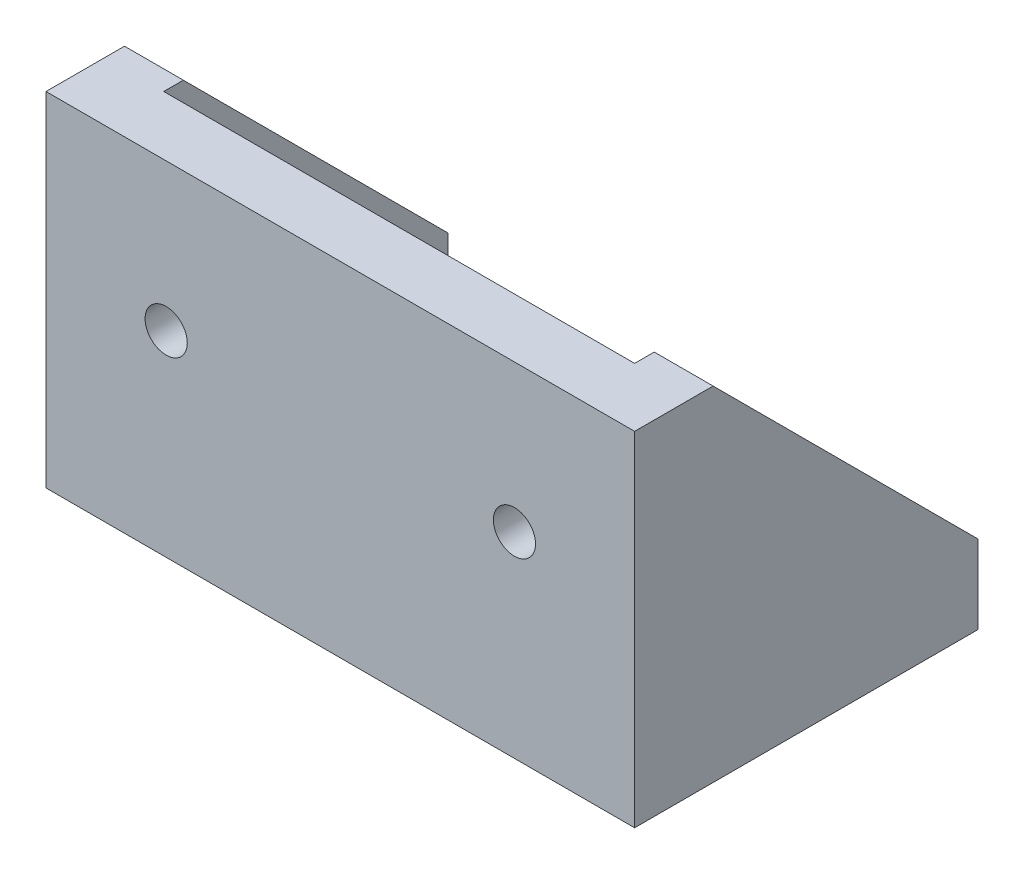
ISO-10303-21;
HEADER;
FILE_DESCRIPTION(('STEP AP214'),'2;1');
FILE_NAME('part.step','',(''),(''),'','','');
FILE_SCHEMA(('AUTOMOTIVE_DESIGN { 1 0 10303 214 1 1 1 1 }'));
ENDSEC;
DATA;
#1=APPLICATION_CONTEXT('core data for automotive mechanical design processes');
#2=APPLICATION_PROTOCOL_DEFINITION('international standard','automotive_design',2000,#1);
#3=PRODUCT_CONTEXT('',#1,'mechanical');
#4=PRODUCT('Part','Part','',(#3));
#5=PRODUCT_RELATED_PRODUCT_CATEGORY('part','',(#4));
#6=PRODUCT_DEFINITION_FORMATION('','',#4);
#7=PRODUCT_DEFINITION_CONTEXT('part definition',#1,'design');
#8=PRODUCT_DEFINITION('design','',#6,#7);
#9=PRODUCT_DEFINITION_SHAPE('','',#8);
#10=(LENGTH_UNIT() NAMED_UNIT(*) SI_UNIT(.MILLI.,.METRE.));
#11=(NAMED_UNIT(*) PLANE_ANGLE_UNIT() SI_UNIT($,.RADIAN.));
#12=(NAMED_UNIT(*) SI_UNIT($,.STERADIAN.) SOLID_ANGLE_UNIT());
#13=UNCERTAINTY_MEASURE_WITH_UNIT(LENGTH_MEASURE(1.E-05),#10,'distance_accuracy_value','');
#14=(GEOMETRIC_REPRESENTATION_CONTEXT(3) GLOBAL_UNCERTAINTY_ASSIGNED_CONTEXT((#13)) GLOBAL_UNIT_ASSIGNED_CONTEXT((#10,
#11,#12)) REPRESENTATION_CONTEXT('',''));
#15=CARTESIAN_POINT('',(0.,0.,0.));
#16=DIRECTION('',(0.,0.,1.));
#17=DIRECTION('',(1.,0.,0.));
#18=AXIS2_PLACEMENT_3D('',#15,#16,#17);
#19=CARTESIAN_POINT('',(30.,8.,-35.));
#20=DIRECTION('',(0.,-0.707106781186547,0.707106781186547));
#21=DIRECTION('',(0.,-0.707106781186548,-0.707106781186548));
#22=AXIS2_PLACEMENT_3D('',#19,#20,#21);
#23=PLANE('',#22);
#24=DIRECTION('',(-1.,0.,0.));
#25=VECTOR('',#24,1.);
#26=CARTESIAN_POINT('',(30.,8.,-35.));
#27=LINE('',#26,#25);
#28=CARTESIAN_POINT('',(30.,8.,-35.));
#29=VERTEX_POINT('',#28);
#30=CARTESIAN_POINT('',(24.,8.,-35.));
#31=VERTEX_POINT('',#30);
#32=EDGE_CURVE('E121',#29,#31,#27,.T.);
#33=ORIENTED_EDGE('',*,*,#32,.T.);
#34=DIRECTION('',(0.,0.707106781186547,0.707106781186547));
#35=VECTOR('',#34,1.);
#36=CARTESIAN_POINT('',(24.,8.,-35.));
#37=LINE('',#36,#35);
#38=CARTESIAN_POINT('',(24.,35.,-8.));
#39=VERTEX_POINT('',#38);
#40=EDGE_CURVE('E11',#31,#39,#37,.T.);
#41=ORIENTED_EDGE('',*,*,#40,.T.);
#42=DIRECTION('',(-1.,0.,0.));
#43=VECTOR('',#42,1.);
#44=CARTESIAN_POINT('',(30.,35.,-8.));
#45=LINE('',#44,#43);
#46=CARTESIAN_POINT('',(30.,35.,-8.));
#47=VERTEX_POINT('',#46);
#48=EDGE_CURVE('E142',#47,#39,#45,.T.);
#49=ORIENTED_EDGE('',*,*,#48,.F.);
#50=DIRECTION('',(0.,0.707106781186548,0.707106781186548));
#51=VECTOR('',#50,1.);
#52=CARTESIAN_POINT('',(30.,8.,-35.));
#53=LINE('',#52,#51);
#54=EDGE_CURVE('E63',#29,#47,#53,.T.);
#55=ORIENTED_EDGE('',*,*,#54,.F.);
#56=EDGE_LOOP('',(#33,#41,#49,#55));
#57=FACE_BOUND('',#56,.T.);
#58=ADVANCED_FACE('F37',(#57),#23,.F.);
#59=CARTESIAN_POINT('',(30.,35.,-8.));
#60=DIRECTION('',(0.,-1.,0.));
#61=DIRECTION('',(0.,0.,-1.));
#62=AXIS2_PLACEMENT_3D('',#59,#60,#61);
#63=PLANE('',#62);
#64=ORIENTED_EDGE('',*,*,#48,.T.);
#65=DIRECTION('',(0.,0.,-1.));
#66=VECTOR('',#65,1.);
#67=CARTESIAN_POINT('',(24.,35.,-6.));
#68=LINE('',#67,#66);
#69=CARTESIAN_POINT('',(24.,35.,-6.));
#70=VERTEX_POINT('',#69);
#71=EDGE_CURVE('E134',#70,#39,#68,.T.);
#72=ORIENTED_EDGE('',*,*,#71,.F.);
#73=DIRECTION('',(1.,0.,0.));
#74=VECTOR('',#73,1.);
#75=CARTESIAN_POINT('',(24.,35.,-6.));
#76=LINE('',#75,#74);
#77=CARTESIAN_POINT('',(-24.,35.,-6.));
#78=VERTEX_POINT('',#77);
#79=EDGE_CURVE('E178',#78,#70,#76,.T.);
#80=ORIENTED_EDGE('',*,*,#79,.F.);
#81=DIRECTION('',(0.,0.,-1.));
#82=VECTOR('',#81,1.);
#83=CARTESIAN_POINT('',(-24.,35.,-6.));
#84=LINE('',#83,#82);
#85=CARTESIAN_POINT('',(-24.,35.,-8.00000000000001));
#86=VERTEX_POINT('',#85);
#87=EDGE_CURVE('E190',#78,#86,#84,.T.);
#88=ORIENTED_EDGE('',*,*,#87,.T.);
#89=CARTESIAN_POINT('',(-30.,35.,-8.));
#90=VERTEX_POINT('',#89);
#91=EDGE_CURVE('E88',#86,#90,#45,.T.);
#92=ORIENTED_EDGE('',*,*,#91,.T.);
#93=DIRECTION('',(0.,0.,1.));
#94=VECTOR('',#93,1.);
#95=CARTESIAN_POINT('',(-30.,35.,-8.));
#96=LINE('',#95,#94);
#97=CARTESIAN_POINT('',(-30.,35.,0.));
#98=VERTEX_POINT('',#97);
#99=EDGE_CURVE('E131',#90,#98,#96,.T.);
#100=ORIENTED_EDGE('',*,*,#99,.T.);
#101=DIRECTION('',(-1.,0.,0.));
#102=VECTOR('',#101,1.);
#103=CARTESIAN_POINT('',(30.,35.,0.));
#104=LINE('',#103,#102);
#105=CARTESIAN_POINT('',(30.,35.,0.));
#106=VERTEX_POINT('',#105);
#107=EDGE_CURVE('E148',#106,#98,#104,.T.);
#108=ORIENTED_EDGE('',*,*,#107,.F.);
#109=DIRECTION('',(0.,0.,1.));
#110=VECTOR('',#109,1.);
#111=CARTESIAN_POINT('',(30.,35.,-8.));
#112=LINE('',#111,#110);
#113=EDGE_CURVE('E141',#47,#106,#112,.T.);
#114=ORIENTED_EDGE('',*,*,#113,.F.);
#115=EDGE_LOOP('',(#64,#72,#80,#88,#92,#100,#108,#114));
#116=FACE_BOUND('',#115,.T.);
#117=ADVANCED_FACE('F39',(#116),#63,.F.);
#118=CARTESIAN_POINT('',(30.,35.,0.));
#119=DIRECTION('',(0.,0.,-1.));
#120=DIRECTION('',(0.,1.,0.));
#121=AXIS2_PLACEMENT_3D('',#118,#119,#120);
#122=PLANE('',#121);
#123=CARTESIAN_POINT('',(-17.75,20.,0.));
#124=DIRECTION('',(0.,0.,1.));
#125=DIRECTION('',(1.,0.,0.));
#126=AXIS2_PLACEMENT_3D('',#123,#124,#125);
#127=CIRCLE('',#126,2.15);
#128=CARTESIAN_POINT('',(-15.6,20.,0.));
#129=VERTEX_POINT('',#128);
#130=EDGE_CURVE('E152',#129,#129,#127,.T.);
#131=ORIENTED_EDGE('',*,*,#130,.F.);
#132=EDGE_LOOP('',(#131));
#133=FACE_BOUND('',#132,.T.);
#134=CARTESIAN_POINT('',(17.75,20.,0.));
#135=DIRECTION('',(0.,0.,1.));
#136=DIRECTION('',(-1.,0.,0.));
#137=AXIS2_PLACEMENT_3D('',#134,#135,#136);
#138=CIRCLE('',#137,2.15);
#139=CARTESIAN_POINT('',(15.6,20.,0.));
#140=VERTEX_POINT('',#139);
#141=EDGE_CURVE('E158',#140,#140,#138,.T.);
#142=ORIENTED_EDGE('',*,*,#141,.F.);
#143=EDGE_LOOP('',(#142));
#144=FACE_BOUND('',#143,.T.);
#145=DIRECTION('',(0.,-1.,0.));
#146=VECTOR('',#145,1.);
#147=CARTESIAN_POINT('',(-30.,35.,0.));
#148=LINE('',#147,#146);
#149=CARTESIAN_POINT('',(-30.,0.,0.));
#150=VERTEX_POINT('',#149);
#151=EDGE_CURVE('E133',#98,#150,#148,.T.);
#152=ORIENTED_EDGE('',*,*,#151,.T.);
#153=DIRECTION('',(-1.,0.,0.));
#154=VECTOR('',#153,1.);
#155=CARTESIAN_POINT('',(30.,0.,0.));
#156=LINE('',#155,#154);
#157=CARTESIAN_POINT('',(30.,0.,0.));
#158=VERTEX_POINT('',#157);
#159=EDGE_CURVE('E120',#158,#150,#156,.T.);
#160=ORIENTED_EDGE('',*,*,#159,.F.);
#161=DIRECTION('',(0.,-1.,0.));
#162=VECTOR('',#161,1.);
#163=CARTESIAN_POINT('',(30.,35.,0.));
#164=LINE('',#163,#162);
#165=EDGE_CURVE('E97',#106,#158,#164,.T.);
#166=ORIENTED_EDGE('',*,*,#165,.F.);
#167=ORIENTED_EDGE('',*,*,#107,.T.);
#168=EDGE_LOOP('',(#152,#160,#166,#167));
#169=FACE_BOUND('',#168,.T.);
#170=ADVANCED_FACE('F199',(#133,#144,#169),#122,.F.);
#171=CARTESIAN_POINT('',(30.,0.,0.));
#172=DIRECTION('',(0.,1.,0.));
#173=DIRECTION('',(0.,0.,1.));
#174=AXIS2_PLACEMENT_3D('',#171,#172,#173);
#175=PLANE('',#174);
#176=CARTESIAN_POINT('',(0.,0.,-11.));
#177=DIRECTION('',(0.,1.,0.));
#178=DIRECTION('',(0.,0.,1.));
#179=AXIS2_PLACEMENT_3D('',#176,#177,#178);
#180=CIRCLE('',#179,3.5);
#181=CARTESIAN_POINT('',(0.,0.,-7.5));
#182=VERTEX_POINT('',#181);
#183=EDGE_CURVE('E163',#182,#182,#180,.T.);
#184=ORIENTED_EDGE('',*,*,#183,.T.);
#185=EDGE_LOOP('',(#184));
#186=FACE_BOUND('',#185,.T.);
#187=CARTESIAN_POINT('',(0.,0.,-29.));
#188=DIRECTION('',(0.,1.,0.));
#189=DIRECTION('',(0.,0.,-1.));
#190=AXIS2_PLACEMENT_3D('',#187,#188,#189);
#191=CIRCLE('',#190,3.5);
#192=CARTESIAN_POINT('',(0.,0.,-32.5));
#193=VERTEX_POINT('',#192);
#194=EDGE_CURVE('E166',#193,#193,#191,.T.);
#195=ORIENTED_EDGE('',*,*,#194,.T.);
#196=EDGE_LOOP('',(#195));
#197=FACE_BOUND('',#196,.T.);
#198=DIRECTION('',(0.,0.,-1.));
#199=VECTOR('',#198,1.);
#200=CARTESIAN_POINT('',(-30.,0.,0.));
#201=LINE('',#200,#199);
#202=CARTESIAN_POINT('',(-30.,0.,-35.));
#203=VERTEX_POINT('',#202);
#204=EDGE_CURVE('E116',#150,#203,#201,.T.);
#205=ORIENTED_EDGE('',*,*,#204,.T.);
#206=DIRECTION('',(-1.,0.,0.));
#207=VECTOR('',#206,1.);
#208=CARTESIAN_POINT('',(30.,0.,-35.));
#209=LINE('',#208,#207);
#210=CARTESIAN_POINT('',(30.,0.,-35.));
#211=VERTEX_POINT('',#210);
#212=EDGE_CURVE('E113',#211,#203,#209,.T.);
#213=ORIENTED_EDGE('',*,*,#212,.F.);
#214=DIRECTION('',(0.,0.,-1.));
#215=VECTOR('',#214,1.);
#216=CARTESIAN_POINT('',(30.,0.,0.));
#217=LINE('',#216,#215);
#218=EDGE_CURVE('E103',#158,#211,#217,.T.);
#219=ORIENTED_EDGE('',*,*,#218,.F.);
#220=ORIENTED_EDGE('',*,*,#159,.T.);
#221=EDGE_LOOP('',(#205,#213,#219,#220));
#222=FACE_BOUND('',#221,.T.);
#223=ADVANCED_FACE('F114',(#186,#197,#222),#175,.F.);
#224=CARTESIAN_POINT('',(30.,0.,-35.));
#225=DIRECTION('',(0.,0.,1.));
#226=DIRECTION('',(1.,0.,0.));
#227=AXIS2_PLACEMENT_3D('',#224,#225,#226);
#228=PLANE('',#227);
#229=DIRECTION('',(-1.,0.,0.));
#230=VECTOR('',#229,1.);
#231=CARTESIAN_POINT('',(24.,6.,-35.));
#232=LINE('',#231,#230);
#233=CARTESIAN_POINT('',(24.,6.,-35.));
#234=VERTEX_POINT('',#233);
#235=CARTESIAN_POINT('',(-24.,6.,-35.));
#236=VERTEX_POINT('',#235);
#237=EDGE_CURVE('E184',#234,#236,#232,.T.);
#238=ORIENTED_EDGE('',*,*,#237,.F.);
#239=DIRECTION('',(0.,-1.,0.));
#240=VECTOR('',#239,1.);
#241=CARTESIAN_POINT('',(24.,6.,-35.));
#242=LINE('',#241,#240);
#243=EDGE_CURVE('E156',#31,#234,#242,.T.);
#244=ORIENTED_EDGE('',*,*,#243,.F.);
#245=ORIENTED_EDGE('',*,*,#32,.F.);
#246=DIRECTION('',(0.,1.,0.));
#247=VECTOR('',#246,1.);
#248=CARTESIAN_POINT('',(30.,0.,-35.));
#249=LINE('',#248,#247);
#250=EDGE_CURVE('E107',#211,#29,#249,.T.);
#251=ORIENTED_EDGE('',*,*,#250,.F.);
#252=ORIENTED_EDGE('',*,*,#212,.T.);
#253=DIRECTION('',(0.,1.,0.));
#254=VECTOR('',#253,1.);
#255=CARTESIAN_POINT('',(-30.,0.,-35.));
#256=LINE('',#255,#254);
#257=CARTESIAN_POINT('',(-30.,8.,-35.));
#258=VERTEX_POINT('',#257);
#259=EDGE_CURVE('E137',#203,#258,#256,.T.);
#260=ORIENTED_EDGE('',*,*,#259,.T.);
#261=CARTESIAN_POINT('',(-24.,8.,-35.));
#262=VERTEX_POINT('',#261);
#263=EDGE_CURVE('E145',#262,#258,#27,.T.);
#264=ORIENTED_EDGE('',*,*,#263,.F.);
#265=DIRECTION('',(0.,1.,0.));
#266=VECTOR('',#265,1.);
#267=CARTESIAN_POINT('',(-24.,6.,-35.));
#268=LINE('',#267,#266);
#269=EDGE_CURVE('E54',#236,#262,#268,.T.);
#270=ORIENTED_EDGE('',*,*,#269,.F.);
#271=EDGE_LOOP('',(#238,#244,#245,#251,#252,#260,#264,#270));
#272=FACE_BOUND('',#271,.T.);
#273=ADVANCED_FACE('F124',(#272),#228,.F.);
#274=ORIENTED_EDGE('',*,*,#91,.F.);
#275=DIRECTION('',(0.,-0.707106781186547,-0.707106781186547));
#276=VECTOR('',#275,1.);
#277=CARTESIAN_POINT('',(-24.,8.,-35.));
#278=LINE('',#277,#276);
#279=EDGE_CURVE('E46',#86,#262,#278,.T.);
#280=ORIENTED_EDGE('',*,*,#279,.T.);
#281=ORIENTED_EDGE('',*,*,#263,.T.);
#282=DIRECTION('',(0.,0.707106781186548,0.707106781186548));
#283=VECTOR('',#282,1.);
#284=CARTESIAN_POINT('',(-30.,8.,-35.));
#285=LINE('',#284,#283);
#286=EDGE_CURVE('E139',#258,#90,#285,.T.);
#287=ORIENTED_EDGE('',*,*,#286,.T.);
#288=EDGE_LOOP('',(#274,#280,#281,#287));
#289=FACE_BOUND('',#288,.T.);
#290=ADVANCED_FACE('F206',(#289),#23,.F.);
#291=CARTESIAN_POINT('',(30.,0.,0.));
#292=DIRECTION('',(1.,0.,0.));
#293=DIRECTION('',(0.,0.,-1.));
#294=AXIS2_PLACEMENT_3D('',#291,#292,#293);
#295=PLANE('',#294);
#296=ORIENTED_EDGE('',*,*,#113,.T.);
#297=ORIENTED_EDGE('',*,*,#165,.T.);
#298=ORIENTED_EDGE('',*,*,#218,.T.);
#299=ORIENTED_EDGE('',*,*,#250,.T.);
#300=ORIENTED_EDGE('',*,*,#54,.T.);
#301=EDGE_LOOP('',(#296,#297,#298,#299,#300));
#302=FACE_BOUND('',#301,.T.);
#303=ADVANCED_FACE('F105',(#302),#295,.T.);
#304=CARTESIAN_POINT('',(-30.,0.,0.));
#305=DIRECTION('',(1.,0.,0.));
#306=DIRECTION('',(0.,0.,-1.));
#307=AXIS2_PLACEMENT_3D('',#304,#305,#306);
#308=PLANE('',#307);
#309=ORIENTED_EDGE('',*,*,#99,.F.);
#310=ORIENTED_EDGE('',*,*,#286,.F.);
#311=ORIENTED_EDGE('',*,*,#259,.F.);
#312=ORIENTED_EDGE('',*,*,#204,.F.);
#313=ORIENTED_EDGE('',*,*,#151,.F.);
#314=EDGE_LOOP('',(#309,#310,#311,#312,#313));
#315=FACE_BOUND('',#314,.T.);
#316=ADVANCED_FACE('F201',(#315),#308,.F.);
#317=CARTESIAN_POINT('',(24.,6.,-6.));
#318=DIRECTION('',(1.,0.,0.));
#319=DIRECTION('',(0.,0.,-1.));
#320=AXIS2_PLACEMENT_3D('',#317,#318,#319);
#321=PLANE('',#320);
#322=ORIENTED_EDGE('',*,*,#243,.T.);
#323=DIRECTION('',(0.,0.,-1.));
#324=VECTOR('',#323,1.);
#325=CARTESIAN_POINT('',(24.,6.,-6.));
#326=LINE('',#325,#324);
#327=CARTESIAN_POINT('',(24.,6.,-6.));
#328=VERTEX_POINT('',#327);
#329=EDGE_CURVE('E181',#328,#234,#326,.T.);
#330=ORIENTED_EDGE('',*,*,#329,.F.);
#331=DIRECTION('',(0.,-1.,0.));
#332=VECTOR('',#331,1.);
#333=CARTESIAN_POINT('',(24.,6.,-6.));
#334=LINE('',#333,#332);
#335=EDGE_CURVE('E169',#70,#328,#334,.T.);
#336=ORIENTED_EDGE('',*,*,#335,.F.);
#337=ORIENTED_EDGE('',*,*,#71,.T.);
#338=ORIENTED_EDGE('',*,*,#40,.F.);
#339=EDGE_LOOP('',(#322,#330,#336,#337,#338));
#340=FACE_BOUND('',#339,.T.);
#341=ADVANCED_FACE('F237',(#340),#321,.F.);
#342=CARTESIAN_POINT('',(-24.,6.,-6.));
#343=DIRECTION('',(-1.,0.,0.));
#344=DIRECTION('',(0.,0.,1.));
#345=AXIS2_PLACEMENT_3D('',#342,#343,#344);
#346=PLANE('',#345);
#347=ORIENTED_EDGE('',*,*,#87,.F.);
#348=DIRECTION('',(0.,1.,0.));
#349=VECTOR('',#348,1.);
#350=CARTESIAN_POINT('',(-24.,6.,-6.));
#351=LINE('',#350,#349);
#352=CARTESIAN_POINT('',(-24.,6.,-6.));
#353=VERTEX_POINT('',#352);
#354=EDGE_CURVE('E175',#353,#78,#351,.T.);
#355=ORIENTED_EDGE('',*,*,#354,.F.);
#356=DIRECTION('',(0.,0.,-1.));
#357=VECTOR('',#356,1.);
#358=CARTESIAN_POINT('',(-24.,6.,-6.));
#359=LINE('',#358,#357);
#360=EDGE_CURVE('E192',#353,#236,#359,.T.);
#361=ORIENTED_EDGE('',*,*,#360,.T.);
#362=ORIENTED_EDGE('',*,*,#269,.T.);
#363=ORIENTED_EDGE('',*,*,#279,.F.);
#364=EDGE_LOOP('',(#347,#355,#361,#362,#363));
#365=FACE_BOUND('',#364,.T.);
#366=ADVANCED_FACE('F209',(#365),#346,.F.);
#367=CARTESIAN_POINT('',(24.,6.,-6.));
#368=DIRECTION('',(0.,-1.,0.));
#369=DIRECTION('',(0.,0.,-1.));
#370=AXIS2_PLACEMENT_3D('',#367,#368,#369);
#371=PLANE('',#370);
#372=CARTESIAN_POINT('',(0.,6.,-11.));
#373=DIRECTION('',(0.,1.,0.));
#374=DIRECTION('',(0.,0.,1.));
#375=AXIS2_PLACEMENT_3D('',#372,#373,#374);
#376=CIRCLE('',#375,3.5);
#377=CARTESIAN_POINT('',(0.,6.,-7.5));
#378=VERTEX_POINT('',#377);
#379=EDGE_CURVE('E292',#378,#378,#376,.T.);
#380=ORIENTED_EDGE('',*,*,#379,.F.);
#381=EDGE_LOOP('',(#380));
#382=FACE_BOUND('',#381,.T.);
#383=CARTESIAN_POINT('',(0.,6.,-29.));
#384=DIRECTION('',(0.,1.,0.));
#385=DIRECTION('',(0.,0.,-1.));
#386=AXIS2_PLACEMENT_3D('',#383,#384,#385);
#387=CIRCLE('',#386,3.5);
#388=CARTESIAN_POINT('',(0.,6.,-32.5));
#389=VERTEX_POINT('',#388);
#390=EDGE_CURVE('E295',#389,#389,#387,.T.);
#391=ORIENTED_EDGE('',*,*,#390,.F.);
#392=EDGE_LOOP('',(#391));
#393=FACE_BOUND('',#392,.T.);
#394=ORIENTED_EDGE('',*,*,#237,.T.);
#395=ORIENTED_EDGE('',*,*,#360,.F.);
#396=DIRECTION('',(-1.,0.,0.));
#397=VECTOR('',#396,1.);
#398=CARTESIAN_POINT('',(24.,6.,-6.));
#399=LINE('',#398,#397);
#400=EDGE_CURVE('E172',#328,#353,#399,.T.);
#401=ORIENTED_EDGE('',*,*,#400,.F.);
#402=ORIENTED_EDGE('',*,*,#329,.T.);
#403=EDGE_LOOP('',(#394,#395,#401,#402));
#404=FACE_BOUND('',#403,.T.);
#405=ADVANCED_FACE('F235',(#382,#393,#404),#371,.F.);
#406=CARTESIAN_POINT('',(0.,0.,-6.));
#407=DIRECTION('',(0.,0.,1.));
#408=DIRECTION('',(1.,0.,0.));
#409=AXIS2_PLACEMENT_3D('',#406,#407,#408);
#410=PLANE('',#409);
#411=CARTESIAN_POINT('',(-17.75,20.,-6.));
#412=DIRECTION('',(0.,0.,1.));
#413=DIRECTION('',(1.,0.,0.));
#414=AXIS2_PLACEMENT_3D('',#411,#412,#413);
#415=CIRCLE('',#414,2.15);
#416=CARTESIAN_POINT('',(-15.6,20.,-6.));
#417=VERTEX_POINT('',#416);
#418=EDGE_CURVE('E41',#417,#417,#415,.T.);
#419=ORIENTED_EDGE('',*,*,#418,.T.);
#420=EDGE_LOOP('',(#419));
#421=FACE_BOUND('',#420,.T.);
#422=CARTESIAN_POINT('',(17.75,20.,-6.));
#423=DIRECTION('',(0.,0.,1.));
#424=DIRECTION('',(1.,0.,0.));
#425=AXIS2_PLACEMENT_3D('',#422,#423,#424);
#426=CIRCLE('',#425,2.15);
#427=CARTESIAN_POINT('',(19.9,20.,-6.));
#428=VERTEX_POINT('',#427);
#429=EDGE_CURVE('E150',#428,#428,#426,.T.);
#430=ORIENTED_EDGE('',*,*,#429,.T.);
#431=EDGE_LOOP('',(#430));
#432=FACE_BOUND('',#431,.T.);
#433=ORIENTED_EDGE('',*,*,#335,.T.);
#434=ORIENTED_EDGE('',*,*,#400,.T.);
#435=ORIENTED_EDGE('',*,*,#354,.T.);
#436=ORIENTED_EDGE('',*,*,#79,.T.);
#437=EDGE_LOOP('',(#433,#434,#435,#436));
#438=FACE_BOUND('',#437,.T.);
#439=ADVANCED_FACE('F219',(#421,#432,#438),#410,.F.);
#440=CARTESIAN_POINT('',(17.75,20.,-35.));
#441=DIRECTION('',(0.,0.,1.));
#442=DIRECTION('',(1.,0.,0.));
#443=AXIS2_PLACEMENT_3D('',#440,#441,#442);
#444=CYLINDRICAL_SURFACE('',#443,2.15);
#445=ORIENTED_EDGE('',*,*,#141,.T.);
#446=EDGE_LOOP('',(#445));
#447=FACE_BOUND('',#446,.T.);
#448=ORIENTED_EDGE('',*,*,#429,.F.);
#449=EDGE_LOOP('',(#448));
#450=FACE_BOUND('',#449,.T.);
#451=ADVANCED_FACE('F271',(#447,#450),#444,.F.);
#452=CARTESIAN_POINT('',(-17.75,20.,-35.));
#453=DIRECTION('',(0.,0.,1.));
#454=DIRECTION('',(1.,0.,0.));
#455=AXIS2_PLACEMENT_3D('',#452,#453,#454);
#456=CYLINDRICAL_SURFACE('',#455,2.15);
#457=ORIENTED_EDGE('',*,*,#130,.T.);
#458=EDGE_LOOP('',(#457));
#459=FACE_BOUND('',#458,.T.);
#460=ORIENTED_EDGE('',*,*,#418,.F.);
#461=EDGE_LOOP('',(#460));
#462=FACE_BOUND('',#461,.T.);
#463=ADVANCED_FACE('F274',(#459,#462),#456,.F.);
#464=CARTESIAN_POINT('',(0.,0.,-29.));
#465=DIRECTION('',(0.,1.,0.));
#466=DIRECTION('',(0.,0.,1.));
#467=AXIS2_PLACEMENT_3D('',#464,#465,#466);
#468=CYLINDRICAL_SURFACE('',#467,3.5);
#469=ORIENTED_EDGE('',*,*,#194,.F.);
#470=EDGE_LOOP('',(#469));
#471=FACE_BOUND('',#470,.T.);
#472=ORIENTED_EDGE('',*,*,#390,.T.);
#473=EDGE_LOOP('',(#472));
#474=FACE_BOUND('',#473,.T.);
#475=ADVANCED_FACE('F280',(#471,#474),#468,.F.);
#476=CARTESIAN_POINT('',(0.,0.,-11.));
#477=DIRECTION('',(0.,1.,0.));
#478=DIRECTION('',(0.,0.,1.));
#479=AXIS2_PLACEMENT_3D('',#476,#477,#478);
#480=CYLINDRICAL_SURFACE('',#479,3.5);
#481=ORIENTED_EDGE('',*,*,#183,.F.);
#482=EDGE_LOOP('',(#481));
#483=FACE_BOUND('',#482,.T.);
#484=ORIENTED_EDGE('',*,*,#379,.T.);
#485=EDGE_LOOP('',(#484));
#486=FACE_BOUND('',#485,.T.);
#487=ADVANCED_FACE('F304',(#483,#486),#480,.F.);
#488=CLOSED_SHELL('',(#58,#117,#170,#223,#273,#290,#303,#316,#341,#366,#405,#439,#451,#463,#475,#487));
#489=MANIFOLD_SOLID_BREP('B2',#488);
#490=ADVANCED_BREP_SHAPE_REPRESENTATION('',(#18,#489),#14);
#491=SHAPE_DEFINITION_REPRESENTATION(#9,#490);
ENDSEC;
END-ISO-10303-21;
